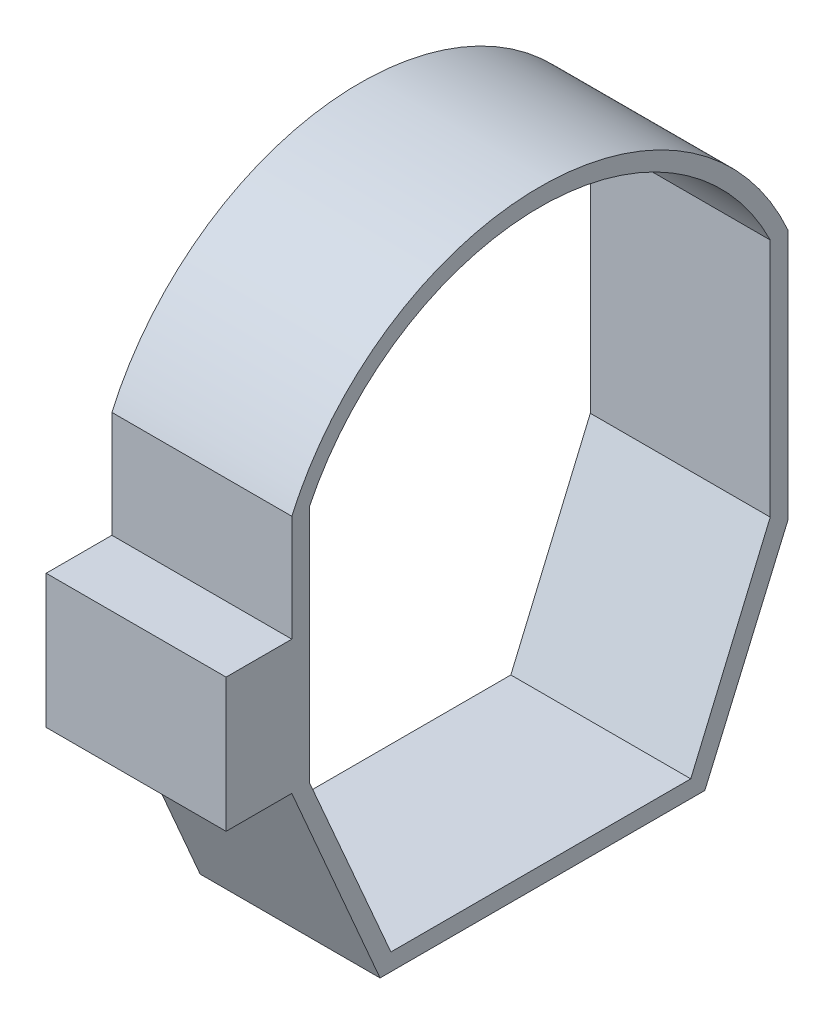
ISO-10303-21;
HEADER;
FILE_DESCRIPTION(('STEP AP214'),'2;1');
FILE_NAME('part.step','',(''),(''),'','','');
FILE_SCHEMA(('AUTOMOTIVE_DESIGN { 1 0 10303 214 1 1 1 1 }'));
ENDSEC;
DATA;
#1=APPLICATION_CONTEXT('core data for automotive mechanical design processes');
#2=APPLICATION_PROTOCOL_DEFINITION('international standard','automotive_design',2000,#1);
#3=PRODUCT_CONTEXT('',#1,'mechanical');
#4=PRODUCT('Part','Part','',(#3));
#5=PRODUCT_RELATED_PRODUCT_CATEGORY('part','',(#4));
#6=PRODUCT_DEFINITION_FORMATION('','',#4);
#7=PRODUCT_DEFINITION_CONTEXT('part definition',#1,'design');
#8=PRODUCT_DEFINITION('design','',#6,#7);
#9=PRODUCT_DEFINITION_SHAPE('','',#8);
#10=(LENGTH_UNIT() NAMED_UNIT(*) SI_UNIT(.MILLI.,.METRE.));
#11=(NAMED_UNIT(*) PLANE_ANGLE_UNIT() SI_UNIT($,.RADIAN.));
#12=(NAMED_UNIT(*) SI_UNIT($,.STERADIAN.) SOLID_ANGLE_UNIT());
#13=UNCERTAINTY_MEASURE_WITH_UNIT(LENGTH_MEASURE(1.E-05),#10,'distance_accuracy_value','');
#14=(GEOMETRIC_REPRESENTATION_CONTEXT(3) GLOBAL_UNCERTAINTY_ASSIGNED_CONTEXT((#13)) GLOBAL_UNIT_ASSIGNED_CONTEXT((#10,
#11,#12)) REPRESENTATION_CONTEXT('',''));
#15=CARTESIAN_POINT('',(0.,0.,0.));
#16=DIRECTION('',(0.,0.,1.));
#17=DIRECTION('',(1.,0.,0.));
#18=AXIS2_PLACEMENT_3D('',#15,#16,#17);
#19=CARTESIAN_POINT('',(-6.13915921043286,18.6009506312889,11.3390076569143));
#20=DIRECTION('',(0.,0.,1.));
#21=DIRECTION('',(1.,0.,0.));
#22=AXIS2_PLACEMENT_3D('',#19,#20,#21);
#23=PLANE('',#22);
#24=DIRECTION('',(0.,-1.,0.));
#25=VECTOR('',#24,1.);
#26=CARTESIAN_POINT('',(-6.13915921043286,18.6009506312889,11.3390076569143));
#27=LINE('',#26,#25);
#28=CARTESIAN_POINT('',(-6.13915921043286,18.6009506312889,11.3390076569143));
#29=VERTEX_POINT('',#28);
#30=CARTESIAN_POINT('',(-6.13915921043286,14.0928595307628,11.3390076569143));
#31=VERTEX_POINT('',#30);
#32=EDGE_CURVE('E154',#29,#31,#27,.T.);
#33=ORIENTED_EDGE('',*,*,#32,.T.);
#34=DIRECTION('',(1.,0.,0.));
#35=VECTOR('',#34,1.);
#36=CARTESIAN_POINT('',(-6.13915921043286,14.0928595307628,11.3390076569143));
#37=LINE('',#36,#35);
#38=CARTESIAN_POINT('',(1.48084078956714,14.0928595307628,11.3390076569143));
#39=VERTEX_POINT('',#38);
#40=EDGE_CURVE('E138',#31,#39,#37,.T.);
#41=ORIENTED_EDGE('',*,*,#40,.T.);
#42=DIRECTION('',(0.,-1.,0.));
#43=VECTOR('',#42,1.);
#44=CARTESIAN_POINT('',(1.48084078956714,18.6009506312889,11.3390076569143));
#45=LINE('',#44,#43);
#46=CARTESIAN_POINT('',(1.48084078956714,18.6009506312889,11.3390076569143));
#47=VERTEX_POINT('',#46);
#48=EDGE_CURVE('E172',#47,#39,#45,.T.);
#49=ORIENTED_EDGE('',*,*,#48,.F.);
#50=DIRECTION('',(1.,0.,0.));
#51=VECTOR('',#50,1.);
#52=CARTESIAN_POINT('',(-6.13915921043286,18.6009506312889,11.3390076569143));
#53=LINE('',#52,#51);
#54=EDGE_CURVE('E160',#29,#47,#53,.T.);
#55=ORIENTED_EDGE('',*,*,#54,.F.);
#56=EDGE_LOOP('',(#33,#41,#49,#55));
#57=FACE_BOUND('',#56,.T.);
#58=ADVANCED_FACE('F32',(#57),#23,.T.);
#59=CARTESIAN_POINT('',(-6.13915921043286,13.9382690734946,0.835284492882604));
#60=DIRECTION('',(1.,0.,0.));
#61=DIRECTION('',(0.,0.,-1.));
#62=AXIS2_PLACEMENT_3D('',#59,#60,#61);
#63=CYLINDRICAL_SURFACE('',#62,11.4921190220086);
#64=ORIENTED_EDGE('',*,*,#54,.T.);
#65=CARTESIAN_POINT('',(1.48084078956714,13.9382690734946,0.835284492882604));
#66=DIRECTION('',(1.,0.,0.));
#67=DIRECTION('',(0.,0.,-1.));
#68=AXIS2_PLACEMENT_3D('',#65,#66,#67);
#69=CIRCLE('',#68,11.4921190220086);
#70=CARTESIAN_POINT('',(1.48084078956714,18.6009506312889,-9.66843867114907));
#71=VERTEX_POINT('',#70);
#72=EDGE_CURVE('E196',#71,#47,#69,.T.);
#73=ORIENTED_EDGE('',*,*,#72,.F.);
#74=DIRECTION('',(1.,0.,0.));
#75=VECTOR('',#74,1.);
#76=CARTESIAN_POINT('',(-6.13915921043286,18.6009506312889,-9.66843867114907));
#77=LINE('',#76,#75);
#78=CARTESIAN_POINT('',(-6.13915921043286,18.6009506312889,-9.66843867114907));
#79=VERTEX_POINT('',#78);
#80=EDGE_CURVE('E11',#79,#71,#77,.T.);
#81=ORIENTED_EDGE('',*,*,#80,.F.);
#82=CARTESIAN_POINT('',(-6.13915921043286,13.9382690734946,0.835284492882604));
#83=DIRECTION('',(1.,0.,0.));
#84=DIRECTION('',(0.,0.,-1.));
#85=AXIS2_PLACEMENT_3D('',#82,#83,#84);
#86=CIRCLE('',#85,11.4921190220086);
#87=EDGE_CURVE('E162',#79,#29,#86,.T.);
#88=ORIENTED_EDGE('',*,*,#87,.T.);
#89=EDGE_LOOP('',(#64,#73,#81,#88));
#90=FACE_BOUND('',#89,.T.);
#91=ADVANCED_FACE('F34',(#90),#63,.T.);
#92=CARTESIAN_POINT('',(-6.13915921043286,7.94500847588581,-9.66843867114907));
#93=DIRECTION('',(0.,0.,-1.));
#94=DIRECTION('',(-1.,0.,0.));
#95=AXIS2_PLACEMENT_3D('',#92,#93,#94);
#96=PLANE('',#95);
#97=ORIENTED_EDGE('',*,*,#80,.T.);
#98=DIRECTION('',(0.,1.,0.));
#99=VECTOR('',#98,1.);
#100=CARTESIAN_POINT('',(1.48084078956714,7.94500847588581,-9.66843867114907));
#101=LINE('',#100,#99);
#102=CARTESIAN_POINT('',(1.48084078956714,7.94500847588581,-9.66843867114907));
#103=VERTEX_POINT('',#102);
#104=EDGE_CURVE('E204',#103,#71,#101,.T.);
#105=ORIENTED_EDGE('',*,*,#104,.F.);
#106=DIRECTION('',(1.,0.,0.));
#107=VECTOR('',#106,1.);
#108=CARTESIAN_POINT('',(-6.13915921043286,7.94500847588581,-9.66843867114907));
#109=LINE('',#108,#107);
#110=CARTESIAN_POINT('',(-6.13915921043286,7.94500847588581,-9.66843867114907));
#111=VERTEX_POINT('',#110);
#112=EDGE_CURVE('E41',#111,#103,#109,.T.);
#113=ORIENTED_EDGE('',*,*,#112,.F.);
#114=DIRECTION('',(0.,1.,0.));
#115=VECTOR('',#114,1.);
#116=CARTESIAN_POINT('',(-6.13915921043286,7.94500847588581,-9.66843867114907));
#117=LINE('',#116,#115);
#118=EDGE_CURVE('E184',#111,#79,#117,.T.);
#119=ORIENTED_EDGE('',*,*,#118,.T.);
#120=EDGE_LOOP('',(#97,#105,#113,#119));
#121=FACE_BOUND('',#120,.T.);
#122=ADVANCED_FACE('F296',(#121),#96,.T.);
#123=CARTESIAN_POINT('',(-6.13915921043286,-0.203787430729512,-6.15473768389292));
#124=DIRECTION('',(0.,-0.395951836257785,-0.918271279831885));
#125=DIRECTION('',(0.,0.918271279831885,-0.395951836257785));
#126=AXIS2_PLACEMENT_3D('',#123,#124,#125);
#127=PLANE('',#126);
#128=ORIENTED_EDGE('',*,*,#112,.T.);
#129=DIRECTION('',(0.,0.918271279831885,-0.395951836257785));
#130=VECTOR('',#129,1.);
#131=CARTESIAN_POINT('',(1.48084078956714,-0.203787430729512,-6.15473768389292));
#132=LINE('',#131,#130);
#133=CARTESIAN_POINT('',(1.48084078956714,-0.203787430729512,-6.15473768389292));
#134=VERTEX_POINT('',#133);
#135=EDGE_CURVE('E218',#134,#103,#132,.T.);
#136=ORIENTED_EDGE('',*,*,#135,.F.);
#137=DIRECTION('',(1.,0.,0.));
#138=VECTOR('',#137,1.);
#139=CARTESIAN_POINT('',(-6.13915921043286,-0.203787430729512,-6.15473768389292));
#140=LINE('',#139,#138);
#141=CARTESIAN_POINT('',(-6.13915921043286,-0.203787430729512,-6.15473768389292));
#142=VERTEX_POINT('',#141);
#143=EDGE_CURVE('E188',#142,#134,#140,.T.);
#144=ORIENTED_EDGE('',*,*,#143,.F.);
#145=DIRECTION('',(0.,0.918271279831885,-0.395951836257785));
#146=VECTOR('',#145,1.);
#147=CARTESIAN_POINT('',(-6.13915921043286,-0.203787430729512,-6.15473768389292));
#148=LINE('',#147,#146);
#149=EDGE_CURVE('E181',#142,#111,#148,.T.);
#150=ORIENTED_EDGE('',*,*,#149,.T.);
#151=EDGE_LOOP('',(#128,#136,#144,#150));
#152=FACE_BOUND('',#151,.T.);
#153=ADVANCED_FACE('F305',(#152),#127,.T.);
#154=CARTESIAN_POINT('',(-6.13915921043286,-0.203787430729512,7.60102788323753));
#155=DIRECTION('',(0.,-1.,0.));
#156=DIRECTION('',(0.,0.,-1.));
#157=AXIS2_PLACEMENT_3D('',#154,#155,#156);
#158=PLANE('',#157);
#159=ORIENTED_EDGE('',*,*,#143,.T.);
#160=DIRECTION('',(0.,0.,-1.));
#161=VECTOR('',#160,1.);
#162=CARTESIAN_POINT('',(1.48084078956714,-0.203787430729512,7.60102788323753));
#163=LINE('',#162,#161);
#164=CARTESIAN_POINT('',(1.48084078956714,-0.203787430729512,7.60102788323753));
#165=VERTEX_POINT('',#164);
#166=EDGE_CURVE('E215',#165,#134,#163,.T.);
#167=ORIENTED_EDGE('',*,*,#166,.F.);
#168=DIRECTION('',(1.,0.,0.));
#169=VECTOR('',#168,1.);
#170=CARTESIAN_POINT('',(-6.13915921043286,-0.203787430729512,7.60102788323753));
#171=LINE('',#170,#169);
#172=CARTESIAN_POINT('',(-6.13915921043286,-0.203787430729512,7.60102788323753));
#173=VERTEX_POINT('',#172);
#174=EDGE_CURVE('E190',#173,#165,#171,.T.);
#175=ORIENTED_EDGE('',*,*,#174,.F.);
#176=DIRECTION('',(0.,0.,-1.));
#177=VECTOR('',#176,1.);
#178=CARTESIAN_POINT('',(-6.13915921043286,-0.203787430729512,7.60102788323753));
#179=LINE('',#178,#177);
#180=EDGE_CURVE('E165',#173,#142,#179,.T.);
#181=ORIENTED_EDGE('',*,*,#180,.T.);
#182=EDGE_LOOP('',(#159,#167,#175,#181));
#183=FACE_BOUND('',#182,.T.);
#184=ADVANCED_FACE('F301',(#183),#158,.T.);
#185=CARTESIAN_POINT('',(-6.13915921043286,8.43676049532631,11.3390076569143));
#186=DIRECTION('',(0.,-0.397047757337721,0.917797950745743));
#187=DIRECTION('',(0.,-0.917797950745743,-0.397047757337721));
#188=AXIS2_PLACEMENT_3D('',#185,#186,#187);
#189=PLANE('',#188);
#190=ORIENTED_EDGE('',*,*,#174,.T.);
#191=DIRECTION('',(0.,-0.917797950745744,-0.397047757337721));
#192=VECTOR('',#191,1.);
#193=CARTESIAN_POINT('',(1.48084078956714,8.43676049532631,11.3390076569143));
#194=LINE('',#193,#192);
#195=CARTESIAN_POINT('',(1.48084078956714,8.43676049532631,11.3390076569143));
#196=VERTEX_POINT('',#195);
#197=EDGE_CURVE('E198',#196,#165,#194,.T.);
#198=ORIENTED_EDGE('',*,*,#197,.F.);
#199=DIRECTION('',(1.,0.,0.));
#200=VECTOR('',#199,1.);
#201=CARTESIAN_POINT('',(-6.13915921043286,8.43676049532631,11.3390076569143));
#202=LINE('',#201,#200);
#203=CARTESIAN_POINT('',(-6.13915921043286,8.43676049532631,11.3390076569143));
#204=VERTEX_POINT('',#203);
#205=EDGE_CURVE('E192',#204,#196,#202,.T.);
#206=ORIENTED_EDGE('',*,*,#205,.F.);
#207=DIRECTION('',(0.,-0.917797950745744,-0.397047757337721));
#208=VECTOR('',#207,1.);
#209=CARTESIAN_POINT('',(-6.13915921043286,8.43676049532631,11.3390076569143));
#210=LINE('',#209,#208);
#211=EDGE_CURVE('E161',#204,#173,#210,.T.);
#212=ORIENTED_EDGE('',*,*,#211,.T.);
#213=EDGE_LOOP('',(#190,#198,#206,#212));
#214=FACE_BOUND('',#213,.T.);
#215=ADVANCED_FACE('F298',(#214),#189,.T.);
#216=CARTESIAN_POINT('',(-6.13915921043286,13.9382690734946,0.835284492882604));
#217=DIRECTION('',(1.,0.,0.));
#218=DIRECTION('',(0.,0.,-1.));
#219=AXIS2_PLACEMENT_3D('',#216,#217,#218);
#220=PLANE('',#219);
#221=DIRECTION('',(0.,1.,0.));
#222=VECTOR('',#221,1.);
#223=CARTESIAN_POINT('',(-6.13915921043286,18.6009506312889,-8.92302406264507));
#224=LINE('',#223,#222);
#225=CARTESIAN_POINT('',(-6.13915921043286,8.4367604953263,-8.92302406264506));
#226=VERTEX_POINT('',#225);
#227=CARTESIAN_POINT('',(-6.13915921043286,18.6009506312889,-8.92302406264507));
#228=VERTEX_POINT('',#227);
#229=EDGE_CURVE('E234',#226,#228,#224,.T.);
#230=ORIENTED_EDGE('',*,*,#229,.T.);
#231=CARTESIAN_POINT('',(-6.13915921043286,13.8387665873362,0.830575937354932));
#232=DIRECTION('',(1.,0.,0.));
#233=DIRECTION('',(0.,0.,-1.));
#234=AXIS2_PLACEMENT_3D('',#231,#232,#233);
#235=CIRCLE('',#234,10.8540826341279);
#236=CARTESIAN_POINT('',(-6.13915921043286,18.6009506312889,10.5841759373549));
#237=VERTEX_POINT('',#236);
#238=EDGE_CURVE('E221',#228,#237,#235,.T.);
#239=ORIENTED_EDGE('',*,*,#238,.T.);
#240=DIRECTION('',(0.,-1.,0.));
#241=VECTOR('',#240,1.);
#242=CARTESIAN_POINT('',(-6.13915921043286,8.43676049532631,10.5841759373549));
#243=LINE('',#242,#241);
#244=CARTESIAN_POINT('',(-6.13915921043286,8.43676049532631,10.5841759373549));
#245=VERTEX_POINT('',#244);
#246=EDGE_CURVE('E224',#237,#245,#243,.T.);
#247=ORIENTED_EDGE('',*,*,#246,.T.);
#248=DIRECTION('',(0.,-0.917063991586131,-0.398740059858691));
#249=VECTOR('',#248,1.);
#250=CARTESIAN_POINT('',(-6.13915921043286,0.521588901078418,7.14265383612892));
#251=LINE('',#250,#249);
#252=CARTESIAN_POINT('',(-6.13915921043286,0.521588901078418,7.14265383612892));
#253=VERTEX_POINT('',#252);
#254=EDGE_CURVE('E57',#245,#253,#251,.T.);
#255=ORIENTED_EDGE('',*,*,#254,.T.);
#256=DIRECTION('',(0.,0.,-1.));
#257=VECTOR('',#256,1.);
#258=CARTESIAN_POINT('',(-6.13915921043286,0.521588901078418,-5.55734616387108));
#259=LINE('',#258,#257);
#260=CARTESIAN_POINT('',(-6.13915921043286,0.521588901078418,-5.55734616387108));
#261=VERTEX_POINT('',#260);
#262=EDGE_CURVE('E228',#253,#261,#259,.T.);
#263=ORIENTED_EDGE('',*,*,#262,.T.);
#264=DIRECTION('',(0.,0.920258498227724,-0.391310997084997));
#265=VECTOR('',#264,1.);
#266=CARTESIAN_POINT('',(-6.13915921043286,8.4367604953263,-8.92302406264506));
#267=LINE('',#266,#265);
#268=EDGE_CURVE('E231',#261,#226,#267,.T.);
#269=ORIENTED_EDGE('',*,*,#268,.T.);
#270=EDGE_LOOP('',(#230,#239,#247,#255,#263,#269));
#271=FACE_BOUND('',#270,.T.);
#272=ORIENTED_EDGE('',*,*,#87,.F.);
#273=ORIENTED_EDGE('',*,*,#118,.F.);
#274=ORIENTED_EDGE('',*,*,#149,.F.);
#275=ORIENTED_EDGE('',*,*,#180,.F.);
#276=ORIENTED_EDGE('',*,*,#211,.F.);
#277=DIRECTION('',(0.,0.,-1.));
#278=VECTOR('',#277,1.);
#279=CARTESIAN_POINT('',(-6.13915921043286,8.43676049532631,11.3390076569143));
#280=LINE('',#279,#278);
#281=CARTESIAN_POINT('',(-6.13915921043286,8.43676049532631,14.1222817564071));
#282=VERTEX_POINT('',#281);
#283=EDGE_CURVE('E147',#282,#204,#280,.T.);
#284=ORIENTED_EDGE('',*,*,#283,.F.);
#285=DIRECTION('',(0.,-1.,0.));
#286=VECTOR('',#285,1.);
#287=CARTESIAN_POINT('',(-6.13915921043286,8.43676049532631,14.1222817564071));
#288=LINE('',#287,#286);
#289=CARTESIAN_POINT('',(-6.13915921043286,14.0928595307628,14.1222817564071));
#290=VERTEX_POINT('',#289);
#291=EDGE_CURVE('E158',#290,#282,#288,.T.);
#292=ORIENTED_EDGE('',*,*,#291,.F.);
#293=DIRECTION('',(0.,0.,1.));
#294=VECTOR('',#293,1.);
#295=CARTESIAN_POINT('',(-6.13915921043286,14.0928595307628,11.3390076569143));
#296=LINE('',#295,#294);
#297=EDGE_CURVE('E141',#31,#290,#296,.T.);
#298=ORIENTED_EDGE('',*,*,#297,.F.);
#299=ORIENTED_EDGE('',*,*,#32,.F.);
#300=EDGE_LOOP('',(#272,#273,#274,#275,#276,#284,#292,#298,#299));
#301=FACE_BOUND('',#300,.T.);
#302=ADVANCED_FACE('F153',(#271,#301),#220,.F.);
#303=CARTESIAN_POINT('',(-6.13915921043286,13.8387665873362,0.830575937354932));
#304=DIRECTION('',(1.,0.,0.));
#305=DIRECTION('',(0.,0.,-1.));
#306=AXIS2_PLACEMENT_3D('',#303,#304,#305);
#307=CYLINDRICAL_SURFACE('',#306,10.8540826341279);
#308=DIRECTION('',(1.,0.,0.));
#309=VECTOR('',#308,1.);
#310=CARTESIAN_POINT('',(-6.13915921043286,18.6009506312889,-8.92302406264507));
#311=LINE('',#310,#309);
#312=CARTESIAN_POINT('',(1.48084078956714,18.6009506312889,-8.92302406264507));
#313=VERTEX_POINT('',#312);
#314=EDGE_CURVE('E167',#228,#313,#311,.T.);
#315=ORIENTED_EDGE('',*,*,#314,.T.);
#316=CARTESIAN_POINT('',(1.48084078956714,13.8387665873362,0.830575937354932));
#317=DIRECTION('',(1.,0.,0.));
#318=DIRECTION('',(0.,0.,-1.));
#319=AXIS2_PLACEMENT_3D('',#316,#317,#318);
#320=CIRCLE('',#319,10.8540826341279);
#321=CARTESIAN_POINT('',(1.48084078956714,18.6009506312889,10.5841759373549));
#322=VERTEX_POINT('',#321);
#323=EDGE_CURVE('E257',#313,#322,#320,.T.);
#324=ORIENTED_EDGE('',*,*,#323,.T.);
#325=DIRECTION('',(1.,0.,0.));
#326=VECTOR('',#325,1.);
#327=CARTESIAN_POINT('',(-6.13915921043286,18.6009506312889,10.5841759373549));
#328=LINE('',#327,#326);
#329=EDGE_CURVE('E237',#237,#322,#328,.T.);
#330=ORIENTED_EDGE('',*,*,#329,.F.);
#331=ORIENTED_EDGE('',*,*,#238,.F.);
#332=EDGE_LOOP('',(#315,#324,#330,#331));
#333=FACE_BOUND('',#332,.T.);
#334=ADVANCED_FACE('F258',(#333),#307,.F.);
#335=CARTESIAN_POINT('',(-6.13915921043286,18.6009506312889,-8.92302406264507));
#336=DIRECTION('',(0.,0.,-1.));
#337=DIRECTION('',(0.,1.,0.));
#338=AXIS2_PLACEMENT_3D('',#335,#336,#337);
#339=PLANE('',#338);
#340=DIRECTION('',(1.,0.,0.));
#341=VECTOR('',#340,1.);
#342=CARTESIAN_POINT('',(-6.13915921043286,8.4367604953263,-8.92302406264506));
#343=LINE('',#342,#341);
#344=CARTESIAN_POINT('',(1.48084078956714,8.4367604953263,-8.92302406264506));
#345=VERTEX_POINT('',#344);
#346=EDGE_CURVE('E239',#226,#345,#343,.T.);
#347=ORIENTED_EDGE('',*,*,#346,.T.);
#348=DIRECTION('',(0.,1.,0.));
#349=VECTOR('',#348,1.);
#350=CARTESIAN_POINT('',(1.48084078956714,18.6009506312889,-8.92302406264507));
#351=LINE('',#350,#349);
#352=EDGE_CURVE('E205',#345,#313,#351,.T.);
#353=ORIENTED_EDGE('',*,*,#352,.T.);
#354=ORIENTED_EDGE('',*,*,#314,.F.);
#355=ORIENTED_EDGE('',*,*,#229,.F.);
#356=EDGE_LOOP('',(#347,#353,#354,#355));
#357=FACE_BOUND('',#356,.T.);
#358=ADVANCED_FACE('F278',(#357),#339,.F.);
#359=CARTESIAN_POINT('',(-6.13915921043286,8.4367604953263,-8.92302406264506));
#360=DIRECTION('',(0.,-0.391310997084997,-0.920258498227724));
#361=DIRECTION('',(0.,0.920258498227724,-0.391310997084997));
#362=AXIS2_PLACEMENT_3D('',#359,#360,#361);
#363=PLANE('',#362);
#364=DIRECTION('',(1.,0.,0.));
#365=VECTOR('',#364,1.);
#366=CARTESIAN_POINT('',(-6.13915921043286,0.521588901078418,-5.55734616387108));
#367=LINE('',#366,#365);
#368=CARTESIAN_POINT('',(1.48084078956714,0.521588901078418,-5.55734616387108));
#369=VERTEX_POINT('',#368);
#370=EDGE_CURVE('E241',#261,#369,#367,.T.);
#371=ORIENTED_EDGE('',*,*,#370,.T.);
#372=DIRECTION('',(0.,0.920258498227724,-0.391310997084997));
#373=VECTOR('',#372,1.);
#374=CARTESIAN_POINT('',(1.48084078956714,8.4367604953263,-8.92302406264506));
#375=LINE('',#374,#373);
#376=EDGE_CURVE('E208',#369,#345,#375,.T.);
#377=ORIENTED_EDGE('',*,*,#376,.T.);
#378=ORIENTED_EDGE('',*,*,#346,.F.);
#379=ORIENTED_EDGE('',*,*,#268,.F.);
#380=EDGE_LOOP('',(#371,#377,#378,#379));
#381=FACE_BOUND('',#380,.T.);
#382=ADVANCED_FACE('F274',(#381),#363,.F.);
#383=CARTESIAN_POINT('',(-6.13915921043286,0.521588901078418,-5.55734616387108));
#384=DIRECTION('',(0.,-1.,0.));
#385=DIRECTION('',(0.,0.,-1.));
#386=AXIS2_PLACEMENT_3D('',#383,#384,#385);
#387=PLANE('',#386);
#388=DIRECTION('',(1.,0.,0.));
#389=VECTOR('',#388,1.);
#390=CARTESIAN_POINT('',(-6.13915921043286,0.521588901078418,7.14265383612892));
#391=LINE('',#390,#389);
#392=CARTESIAN_POINT('',(1.48084078956714,0.521588901078418,7.14265383612892));
#393=VERTEX_POINT('',#392);
#394=EDGE_CURVE('E243',#253,#393,#391,.T.);
#395=ORIENTED_EDGE('',*,*,#394,.T.);
#396=DIRECTION('',(0.,0.,-1.));
#397=VECTOR('',#396,1.);
#398=CARTESIAN_POINT('',(1.48084078956714,0.521588901078418,-5.55734616387108));
#399=LINE('',#398,#397);
#400=EDGE_CURVE('E266',#393,#369,#399,.T.);
#401=ORIENTED_EDGE('',*,*,#400,.T.);
#402=ORIENTED_EDGE('',*,*,#370,.F.);
#403=ORIENTED_EDGE('',*,*,#262,.F.);
#404=EDGE_LOOP('',(#395,#401,#402,#403));
#405=FACE_BOUND('',#404,.T.);
#406=ADVANCED_FACE('F282',(#405),#387,.F.);
#407=CARTESIAN_POINT('',(-6.13915921043286,0.521588901078418,7.14265383612892));
#408=DIRECTION('',(0.,-0.398740059858691,0.917063991586131));
#409=DIRECTION('',(0.,-0.917063991586131,-0.398740059858691));
#410=AXIS2_PLACEMENT_3D('',#407,#408,#409);
#411=PLANE('',#410);
#412=DIRECTION('',(1.,0.,0.));
#413=VECTOR('',#412,1.);
#414=CARTESIAN_POINT('',(-6.13915921043286,8.43676049532631,10.5841759373549));
#415=LINE('',#414,#413);
#416=CARTESIAN_POINT('',(1.48084078956714,8.43676049532631,10.5841759373549));
#417=VERTEX_POINT('',#416);
#418=EDGE_CURVE('E245',#245,#417,#415,.T.);
#419=ORIENTED_EDGE('',*,*,#418,.T.);
#420=DIRECTION('',(0.,-0.917063991586131,-0.398740059858691));
#421=VECTOR('',#420,1.);
#422=CARTESIAN_POINT('',(1.48084078956714,0.521588901078418,7.14265383612892));
#423=LINE('',#422,#421);
#424=EDGE_CURVE('E264',#417,#393,#423,.T.);
#425=ORIENTED_EDGE('',*,*,#424,.T.);
#426=ORIENTED_EDGE('',*,*,#394,.F.);
#427=ORIENTED_EDGE('',*,*,#254,.F.);
#428=EDGE_LOOP('',(#419,#425,#426,#427));
#429=FACE_BOUND('',#428,.T.);
#430=ADVANCED_FACE('F283',(#429),#411,.F.);
#431=CARTESIAN_POINT('',(-6.13915921043286,8.43676049532631,10.5841759373549));
#432=DIRECTION('',(0.,0.,1.));
#433=DIRECTION('',(0.,-1.,0.));
#434=AXIS2_PLACEMENT_3D('',#431,#432,#433);
#435=PLANE('',#434);
#436=ORIENTED_EDGE('',*,*,#329,.T.);
#437=DIRECTION('',(0.,-1.,0.));
#438=VECTOR('',#437,1.);
#439=CARTESIAN_POINT('',(1.48084078956714,8.43676049532631,10.5841759373549));
#440=LINE('',#439,#438);
#441=EDGE_CURVE('E252',#322,#417,#440,.T.);
#442=ORIENTED_EDGE('',*,*,#441,.T.);
#443=ORIENTED_EDGE('',*,*,#418,.F.);
#444=ORIENTED_EDGE('',*,*,#246,.F.);
#445=EDGE_LOOP('',(#436,#442,#443,#444));
#446=FACE_BOUND('',#445,.T.);
#447=ADVANCED_FACE('F250',(#446),#435,.F.);
#448=CARTESIAN_POINT('',(1.48084078956714,13.9382690734946,0.835284492882604));
#449=DIRECTION('',(1.,0.,0.));
#450=DIRECTION('',(0.,0.,-1.));
#451=AXIS2_PLACEMENT_3D('',#448,#449,#450);
#452=PLANE('',#451);
#453=ORIENTED_EDGE('',*,*,#72,.T.);
#454=ORIENTED_EDGE('',*,*,#48,.T.);
#455=DIRECTION('',(0.,0.,1.));
#456=VECTOR('',#455,1.);
#457=CARTESIAN_POINT('',(1.48084078956714,14.0928595307628,11.3390076569143));
#458=LINE('',#457,#456);
#459=CARTESIAN_POINT('',(1.48084078956714,14.0928595307628,14.1222817564071));
#460=VERTEX_POINT('',#459);
#461=EDGE_CURVE('E49',#39,#460,#458,.T.);
#462=ORIENTED_EDGE('',*,*,#461,.T.);
#463=DIRECTION('',(0.,-1.,0.));
#464=VECTOR('',#463,1.);
#465=CARTESIAN_POINT('',(1.48084078956714,8.43676049532631,14.1222817564071));
#466=LINE('',#465,#464);
#467=CARTESIAN_POINT('',(1.48084078956714,8.43676049532631,14.1222817564071));
#468=VERTEX_POINT('',#467);
#469=EDGE_CURVE('E343',#460,#468,#466,.T.);
#470=ORIENTED_EDGE('',*,*,#469,.T.);
#471=DIRECTION('',(0.,0.,-1.));
#472=VECTOR('',#471,1.);
#473=CARTESIAN_POINT('',(1.48084078956714,8.43676049532631,11.3390076569143));
#474=LINE('',#473,#472);
#475=EDGE_CURVE('E159',#468,#196,#474,.T.);
#476=ORIENTED_EDGE('',*,*,#475,.T.);
#477=ORIENTED_EDGE('',*,*,#197,.T.);
#478=ORIENTED_EDGE('',*,*,#166,.T.);
#479=ORIENTED_EDGE('',*,*,#135,.T.);
#480=ORIENTED_EDGE('',*,*,#104,.T.);
#481=EDGE_LOOP('',(#453,#454,#462,#470,#476,#477,#478,#479,#480));
#482=FACE_BOUND('',#481,.T.);
#483=ORIENTED_EDGE('',*,*,#441,.F.);
#484=ORIENTED_EDGE('',*,*,#323,.F.);
#485=ORIENTED_EDGE('',*,*,#352,.F.);
#486=ORIENTED_EDGE('',*,*,#376,.F.);
#487=ORIENTED_EDGE('',*,*,#400,.F.);
#488=ORIENTED_EDGE('',*,*,#424,.F.);
#489=EDGE_LOOP('',(#483,#484,#485,#486,#487,#488));
#490=FACE_BOUND('',#489,.T.);
#491=ADVANCED_FACE('F200',(#482,#490),#452,.T.);
#492=CARTESIAN_POINT('',(-6.13915921043286,8.43676049532631,11.3390076569143));
#493=DIRECTION('',(0.,-1.,0.));
#494=DIRECTION('',(0.,0.,-1.));
#495=AXIS2_PLACEMENT_3D('',#492,#493,#494);
#496=PLANE('',#495);
#497=ORIENTED_EDGE('',*,*,#475,.F.);
#498=DIRECTION('',(1.,0.,0.));
#499=VECTOR('',#498,1.);
#500=CARTESIAN_POINT('',(-6.13915921043286,8.43676049532631,14.1222817564071));
#501=LINE('',#500,#499);
#502=EDGE_CURVE('E260',#282,#468,#501,.T.);
#503=ORIENTED_EDGE('',*,*,#502,.F.);
#504=ORIENTED_EDGE('',*,*,#283,.T.);
#505=ORIENTED_EDGE('',*,*,#205,.T.);
#506=EDGE_LOOP('',(#497,#503,#504,#505));
#507=FACE_BOUND('',#506,.T.);
#508=ADVANCED_FACE('F327',(#507),#496,.T.);
#509=CARTESIAN_POINT('',(-6.13915921043286,8.43676049532631,14.1222817564071));
#510=DIRECTION('',(0.,0.,1.));
#511=DIRECTION('',(1.,0.,0.));
#512=AXIS2_PLACEMENT_3D('',#509,#510,#511);
#513=PLANE('',#512);
#514=ORIENTED_EDGE('',*,*,#469,.F.);
#515=DIRECTION('',(1.,0.,0.));
#516=VECTOR('',#515,1.);
#517=CARTESIAN_POINT('',(-6.13915921043286,14.0928595307628,14.1222817564071));
#518=LINE('',#517,#516);
#519=EDGE_CURVE('E146',#290,#460,#518,.T.);
#520=ORIENTED_EDGE('',*,*,#519,.F.);
#521=ORIENTED_EDGE('',*,*,#291,.T.);
#522=ORIENTED_EDGE('',*,*,#502,.T.);
#523=EDGE_LOOP('',(#514,#520,#521,#522));
#524=FACE_BOUND('',#523,.T.);
#525=ADVANCED_FACE('F330',(#524),#513,.T.);
#526=CARTESIAN_POINT('',(-6.13915921043286,14.0928595307628,11.3390076569143));
#527=DIRECTION('',(0.,1.,0.));
#528=DIRECTION('',(0.,0.,1.));
#529=AXIS2_PLACEMENT_3D('',#526,#527,#528);
#530=PLANE('',#529);
#531=ORIENTED_EDGE('',*,*,#461,.F.);
#532=ORIENTED_EDGE('',*,*,#40,.F.);
#533=ORIENTED_EDGE('',*,*,#297,.T.);
#534=ORIENTED_EDGE('',*,*,#519,.T.);
#535=EDGE_LOOP('',(#531,#532,#533,#534));
#536=FACE_BOUND('',#535,.T.);
#537=ADVANCED_FACE('F140',(#536),#530,.T.);
#538=CLOSED_SHELL('',(#58,#91,#122,#153,#184,#215,#302,#334,#358,#382,#406,#430,#447,#491,#508,
#525,#537));
#539=MANIFOLD_SOLID_BREP('B2',#538);
#540=ADVANCED_BREP_SHAPE_REPRESENTATION('',(#18,#539),#14);
#541=SHAPE_DEFINITION_REPRESENTATION(#9,#540);
ENDSEC;
END-ISO-10303-21;
